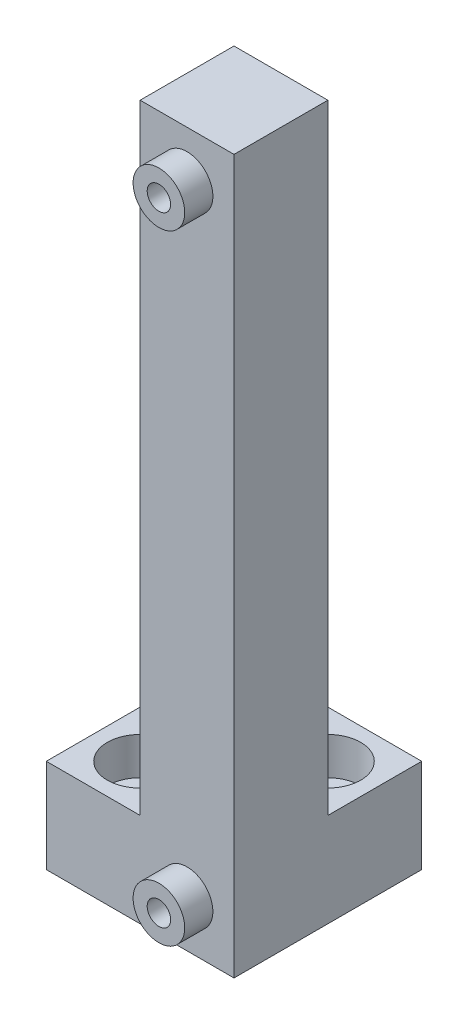
ISO-10303-21;
HEADER;
FILE_DESCRIPTION(('STEP AP214'),'2;1');
FILE_NAME('part.step','',(''),(''),'','','');
FILE_SCHEMA(('AUTOMOTIVE_DESIGN { 1 0 10303 214 1 1 1 1 }'));
ENDSEC;
DATA;
#1=APPLICATION_CONTEXT('core data for automotive mechanical design processes');
#2=APPLICATION_PROTOCOL_DEFINITION('international standard','automotive_design',2000,#1);
#3=PRODUCT_CONTEXT('',#1,'mechanical');
#4=PRODUCT('Part','Part','',(#3));
#5=PRODUCT_RELATED_PRODUCT_CATEGORY('part','',(#4));
#6=PRODUCT_DEFINITION_FORMATION('','',#4);
#7=PRODUCT_DEFINITION_CONTEXT('part definition',#1,'design');
#8=PRODUCT_DEFINITION('design','',#6,#7);
#9=PRODUCT_DEFINITION_SHAPE('','',#8);
#10=(LENGTH_UNIT() NAMED_UNIT(*) SI_UNIT(.MILLI.,.METRE.));
#11=(NAMED_UNIT(*) PLANE_ANGLE_UNIT() SI_UNIT($,.RADIAN.));
#12=(NAMED_UNIT(*) SI_UNIT($,.STERADIAN.) SOLID_ANGLE_UNIT());
#13=UNCERTAINTY_MEASURE_WITH_UNIT(LENGTH_MEASURE(1.E-05),#10,'distance_accuracy_value','');
#14=(GEOMETRIC_REPRESENTATION_CONTEXT(3) GLOBAL_UNCERTAINTY_ASSIGNED_CONTEXT((#13)) GLOBAL_UNIT_ASSIGNED_CONTEXT((#10,
#11,#12)) REPRESENTATION_CONTEXT('',''));
#15=CARTESIAN_POINT('',(0.,0.,0.));
#16=DIRECTION('',(0.,0.,1.));
#17=DIRECTION('',(1.,0.,0.));
#18=AXIS2_PLACEMENT_3D('',#15,#16,#17);
#19=CARTESIAN_POINT('',(-5.,-0.00100000000000447,-5.));
#20=DIRECTION('',(0.,1.,0.));
#21=DIRECTION('',(-1.,0.,0.));
#22=AXIS2_PLACEMENT_3D('',#19,#20,#21);
#23=CYLINDRICAL_SURFACE('',#22,1.75);
#24=CARTESIAN_POINT('',(-5.,0.,-5.));
#25=DIRECTION('',(0.,1.,0.));
#26=DIRECTION('',(0.,0.,1.));
#27=AXIS2_PLACEMENT_3D('',#24,#25,#26);
#28=CIRCLE('',#27,1.75);
#29=CARTESIAN_POINT('',(-5.,0.,-3.25));
#30=VERTEX_POINT('',#29);
#31=EDGE_CURVE('E138',#30,#30,#28,.F.);
#32=ORIENTED_EDGE('',*,*,#31,.T.);
#33=EDGE_LOOP('',(#32));
#34=FACE_BOUND('',#33,.T.);
#35=CARTESIAN_POINT('',(-5.,5.99999999999999,-5.));
#36=DIRECTION('',(0.,1.,0.));
#37=DIRECTION('',(-1.,0.,0.));
#38=AXIS2_PLACEMENT_3D('',#35,#36,#37);
#39=CIRCLE('',#38,1.75);
#40=CARTESIAN_POINT('',(-6.75,5.99999999999999,-5.));
#41=VERTEX_POINT('',#40);
#42=EDGE_CURVE('E38',#41,#41,#39,.F.);
#43=ORIENTED_EDGE('',*,*,#42,.F.);
#44=EDGE_LOOP('',(#43));
#45=FACE_BOUND('',#44,.T.);
#46=ADVANCED_FACE('F34',(#34,#45),#23,.F.);
#47=CARTESIAN_POINT('',(-15.,-0.001000000000001,5.));
#48=DIRECTION('',(0.,1.,0.));
#49=DIRECTION('',(-1.,0.,0.));
#50=AXIS2_PLACEMENT_3D('',#47,#48,#49);
#51=CYLINDRICAL_SURFACE('',#50,1.75);
#52=CARTESIAN_POINT('',(-15.,0.,5.));
#53=DIRECTION('',(0.,1.,0.));
#54=DIRECTION('',(0.,0.,1.));
#55=AXIS2_PLACEMENT_3D('',#52,#53,#54);
#56=CIRCLE('',#55,1.75);
#57=CARTESIAN_POINT('',(-15.,0.,6.75));
#58=VERTEX_POINT('',#57);
#59=EDGE_CURVE('E144',#58,#58,#56,.F.);
#60=ORIENTED_EDGE('',*,*,#59,.T.);
#61=EDGE_LOOP('',(#60));
#62=FACE_BOUND('',#61,.T.);
#63=CARTESIAN_POINT('',(-15.,6.,5.));
#64=DIRECTION('',(0.,1.,0.));
#65=DIRECTION('',(-1.,0.,0.));
#66=AXIS2_PLACEMENT_3D('',#63,#64,#65);
#67=CIRCLE('',#66,1.75);
#68=CARTESIAN_POINT('',(-16.75,6.,5.));
#69=VERTEX_POINT('',#68);
#70=EDGE_CURVE('E206',#69,#69,#67,.F.);
#71=ORIENTED_EDGE('',*,*,#70,.F.);
#72=EDGE_LOOP('',(#71));
#73=FACE_BOUND('',#72,.T.);
#74=ADVANCED_FACE('F247',(#62,#73),#51,.F.);
#75=CARTESIAN_POINT('',(0.,0.,0.));
#76=DIRECTION('',(0.,0.,-1.));
#77=DIRECTION('',(-1.,0.,0.));
#78=AXIS2_PLACEMENT_3D('',#75,#76,#77);
#79=PLANE('',#78);
#80=DIRECTION('',(1.,0.,0.));
#81=VECTOR('',#80,1.);
#82=CARTESIAN_POINT('',(0.,9.99999999999999,0.));
#83=LINE('',#82,#81);
#84=CARTESIAN_POINT('',(-10.,9.99999999999999,0.));
#85=VERTEX_POINT('',#84);
#86=CARTESIAN_POINT('',(0.,9.99999999999999,0.));
#87=VERTEX_POINT('',#86);
#88=EDGE_CURVE('E134',#85,#87,#83,.T.);
#89=ORIENTED_EDGE('',*,*,#88,.F.);
#90=DIRECTION('',(0.,-1.,0.));
#91=VECTOR('',#90,1.);
#92=CARTESIAN_POINT('',(-10.,9.99999999999999,0.));
#93=LINE('',#92,#91);
#94=CARTESIAN_POINT('',(-10.,76.,0.));
#95=VERTEX_POINT('',#94);
#96=EDGE_CURVE('E169',#95,#85,#93,.T.);
#97=ORIENTED_EDGE('',*,*,#96,.F.);
#98=DIRECTION('',(-1.,0.,0.));
#99=VECTOR('',#98,1.);
#100=CARTESIAN_POINT('',(-10.,76.,0.));
#101=LINE('',#100,#99);
#102=CARTESIAN_POINT('',(0.,76.,0.));
#103=VERTEX_POINT('',#102);
#104=EDGE_CURVE('E174',#103,#95,#101,.T.);
#105=ORIENTED_EDGE('',*,*,#104,.F.);
#106=DIRECTION('',(0.,1.,0.));
#107=VECTOR('',#106,1.);
#108=CARTESIAN_POINT('',(0.,76.,0.));
#109=LINE('',#108,#107);
#110=EDGE_CURVE('E59',#87,#103,#109,.T.);
#111=ORIENTED_EDGE('',*,*,#110,.F.);
#112=EDGE_LOOP('',(#89,#97,#105,#111));
#113=FACE_BOUND('',#112,.T.);
#114=ADVANCED_FACE('F252',(#113),#79,.T.);
#115=CARTESIAN_POINT('',(-10.,9.99999999999999,10.));
#116=DIRECTION('',(1.,0.,0.));
#117=DIRECTION('',(0.,1.,0.));
#118=AXIS2_PLACEMENT_3D('',#115,#116,#117);
#119=PLANE('',#118);
#120=ORIENTED_EDGE('',*,*,#96,.T.);
#121=DIRECTION('',(0.,0.,-1.));
#122=VECTOR('',#121,1.);
#123=CARTESIAN_POINT('',(-10.,9.99999999999999,10.));
#124=LINE('',#123,#122);
#125=CARTESIAN_POINT('',(-10.,9.99999999999999,10.));
#126=VERTEX_POINT('',#125);
#127=EDGE_CURVE('E202',#126,#85,#124,.T.);
#128=ORIENTED_EDGE('',*,*,#127,.F.);
#129=DIRECTION('',(0.,-1.,0.));
#130=VECTOR('',#129,1.);
#131=CARTESIAN_POINT('',(-10.,9.99999999999999,10.));
#132=LINE('',#131,#130);
#133=CARTESIAN_POINT('',(-10.,76.,10.));
#134=VERTEX_POINT('',#133);
#135=EDGE_CURVE('E170',#134,#126,#132,.T.);
#136=ORIENTED_EDGE('',*,*,#135,.F.);
#137=DIRECTION('',(0.,0.,-1.));
#138=VECTOR('',#137,1.);
#139=CARTESIAN_POINT('',(-10.,76.,10.));
#140=LINE('',#139,#138);
#141=EDGE_CURVE('E183',#134,#95,#140,.T.);
#142=ORIENTED_EDGE('',*,*,#141,.T.);
#143=EDGE_LOOP('',(#120,#128,#136,#142));
#144=FACE_BOUND('',#143,.T.);
#145=ADVANCED_FACE('F36',(#144),#119,.F.);
#146=CARTESIAN_POINT('',(-20.,10.,10.));
#147=DIRECTION('',(0.,-1.,0.));
#148=DIRECTION('',(1.,0.,0.));
#149=AXIS2_PLACEMENT_3D('',#146,#147,#148);
#150=PLANE('',#149);
#151=CARTESIAN_POINT('',(-15.,10.,5.));
#152=DIRECTION('',(0.,1.,0.));
#153=DIRECTION('',(-1.,0.,0.));
#154=AXIS2_PLACEMENT_3D('',#151,#152,#153);
#155=CIRCLE('',#154,3.5);
#156=CARTESIAN_POINT('',(-18.5,10.,5.));
#157=VERTEX_POINT('',#156);
#158=EDGE_CURVE('E213',#157,#157,#155,.T.);
#159=ORIENTED_EDGE('',*,*,#158,.F.);
#160=EDGE_LOOP('',(#159));
#161=FACE_BOUND('',#160,.T.);
#162=DIRECTION('',(-1.,0.,0.));
#163=VECTOR('',#162,1.);
#164=CARTESIAN_POINT('',(-20.,10.,0.));
#165=LINE('',#164,#163);
#166=CARTESIAN_POINT('',(-20.,10.,0.));
#167=VERTEX_POINT('',#166);
#168=EDGE_CURVE('E185',#85,#167,#165,.T.);
#169=ORIENTED_EDGE('',*,*,#168,.T.);
#170=DIRECTION('',(0.,0.,-1.));
#171=VECTOR('',#170,1.);
#172=CARTESIAN_POINT('',(-20.,10.,10.));
#173=LINE('',#172,#171);
#174=CARTESIAN_POINT('',(-20.,10.,10.));
#175=VERTEX_POINT('',#174);
#176=EDGE_CURVE('E199',#175,#167,#173,.T.);
#177=ORIENTED_EDGE('',*,*,#176,.F.);
#178=DIRECTION('',(-1.,0.,0.));
#179=VECTOR('',#178,1.);
#180=CARTESIAN_POINT('',(-20.,10.,10.));
#181=LINE('',#180,#179);
#182=EDGE_CURVE('E173',#126,#175,#181,.T.);
#183=ORIENTED_EDGE('',*,*,#182,.F.);
#184=ORIENTED_EDGE('',*,*,#127,.T.);
#185=EDGE_LOOP('',(#169,#177,#183,#184));
#186=FACE_BOUND('',#185,.T.);
#187=ADVANCED_FACE('F243',(#161,#186),#150,.F.);
#188=CARTESIAN_POINT('',(-20.,0.,10.));
#189=DIRECTION('',(1.,0.,0.));
#190=DIRECTION('',(0.,1.,0.));
#191=AXIS2_PLACEMENT_3D('',#188,#189,#190);
#192=PLANE('',#191);
#193=DIRECTION('',(0.,-1.,0.));
#194=VECTOR('',#193,1.);
#195=CARTESIAN_POINT('',(-20.,0.,0.));
#196=LINE('',#195,#194);
#197=CARTESIAN_POINT('',(-20.,0.,0.));
#198=VERTEX_POINT('',#197);
#199=EDGE_CURVE('E187',#167,#198,#196,.T.);
#200=ORIENTED_EDGE('',*,*,#199,.T.);
#201=DIRECTION('',(0.,0.,-1.));
#202=VECTOR('',#201,1.);
#203=CARTESIAN_POINT('',(-20.,0.,10.));
#204=LINE('',#203,#202);
#205=CARTESIAN_POINT('',(-20.,0.,10.));
#206=VERTEX_POINT('',#205);
#207=EDGE_CURVE('E118',#206,#198,#204,.T.);
#208=ORIENTED_EDGE('',*,*,#207,.F.);
#209=DIRECTION('',(0.,-1.,0.));
#210=VECTOR('',#209,1.);
#211=CARTESIAN_POINT('',(-20.,0.,10.));
#212=LINE('',#211,#210);
#213=EDGE_CURVE('E176',#175,#206,#212,.T.);
#214=ORIENTED_EDGE('',*,*,#213,.F.);
#215=ORIENTED_EDGE('',*,*,#176,.T.);
#216=EDGE_LOOP('',(#200,#208,#214,#215));
#217=FACE_BOUND('',#216,.T.);
#218=ADVANCED_FACE('F234',(#217),#192,.F.);
#219=CARTESIAN_POINT('',(0.,0.,10.));
#220=DIRECTION('',(0.,1.,0.));
#221=DIRECTION('',(0.,0.,1.));
#222=AXIS2_PLACEMENT_3D('',#219,#220,#221);
#223=PLANE('',#222);
#224=ORIENTED_EDGE('',*,*,#59,.F.);
#225=EDGE_LOOP('',(#224));
#226=FACE_BOUND('',#225,.T.);
#227=ORIENTED_EDGE('',*,*,#31,.F.);
#228=EDGE_LOOP('',(#227));
#229=FACE_BOUND('',#228,.T.);
#230=DIRECTION('',(1.,0.,0.));
#231=VECTOR('',#230,1.);
#232=CARTESIAN_POINT('',(0.,0.,0.));
#233=LINE('',#232,#231);
#234=CARTESIAN_POINT('',(-10.,0.,0.));
#235=VERTEX_POINT('',#234);
#236=EDGE_CURVE('E189',#198,#235,#233,.T.);
#237=ORIENTED_EDGE('',*,*,#236,.T.);
#238=DIRECTION('',(0.,0.,1.));
#239=VECTOR('',#238,1.);
#240=CARTESIAN_POINT('',(-10.,0.,-10.));
#241=LINE('',#240,#239);
#242=CARTESIAN_POINT('',(-10.,0.,-10.));
#243=VERTEX_POINT('',#242);
#244=EDGE_CURVE('E125',#243,#235,#241,.T.);
#245=ORIENTED_EDGE('',*,*,#244,.F.);
#246=DIRECTION('',(-1.,0.,0.));
#247=VECTOR('',#246,1.);
#248=CARTESIAN_POINT('',(0.,0.,-10.));
#249=LINE('',#248,#247);
#250=CARTESIAN_POINT('',(0.,0.,-10.));
#251=VERTEX_POINT('',#250);
#252=EDGE_CURVE('E122',#251,#243,#249,.T.);
#253=ORIENTED_EDGE('',*,*,#252,.F.);
#254=DIRECTION('',(0.,0.,-1.));
#255=VECTOR('',#254,1.);
#256=CARTESIAN_POINT('',(0.,0.,10.));
#257=LINE('',#256,#255);
#258=CARTESIAN_POINT('',(0.,0.,10.));
#259=VERTEX_POINT('',#258);
#260=EDGE_CURVE('E108',#259,#251,#257,.T.);
#261=ORIENTED_EDGE('',*,*,#260,.F.);
#262=DIRECTION('',(1.,0.,0.));
#263=VECTOR('',#262,1.);
#264=CARTESIAN_POINT('',(0.,0.,10.));
#265=LINE('',#264,#263);
#266=EDGE_CURVE('E178',#206,#259,#265,.T.);
#267=ORIENTED_EDGE('',*,*,#266,.F.);
#268=ORIENTED_EDGE('',*,*,#207,.T.);
#269=EDGE_LOOP('',(#237,#245,#253,#261,#267,#268));
#270=FACE_BOUND('',#269,.T.);
#271=ADVANCED_FACE('F123',(#226,#229,#270),#223,.F.);
#272=CARTESIAN_POINT('',(0.,76.,10.));
#273=DIRECTION('',(-1.,0.,0.));
#274=DIRECTION('',(0.,-1.,0.));
#275=AXIS2_PLACEMENT_3D('',#272,#273,#274);
#276=PLANE('',#275);
#277=ORIENTED_EDGE('',*,*,#260,.T.);
#278=DIRECTION('',(0.,-1.,0.));
#279=VECTOR('',#278,1.);
#280=CARTESIAN_POINT('',(0.,9.99999999999999,-10.));
#281=LINE('',#280,#279);
#282=CARTESIAN_POINT('',(0.,9.99999999999999,-10.));
#283=VERTEX_POINT('',#282);
#284=EDGE_CURVE('E113',#283,#251,#281,.T.);
#285=ORIENTED_EDGE('',*,*,#284,.F.);
#286=DIRECTION('',(0.,0.,1.));
#287=VECTOR('',#286,1.);
#288=CARTESIAN_POINT('',(0.,9.99999999999999,-10.));
#289=LINE('',#288,#287);
#290=EDGE_CURVE('E143',#283,#87,#289,.T.);
#291=ORIENTED_EDGE('',*,*,#290,.T.);
#292=ORIENTED_EDGE('',*,*,#110,.T.);
#293=DIRECTION('',(0.,0.,-1.));
#294=VECTOR('',#293,1.);
#295=CARTESIAN_POINT('',(0.,76.,10.));
#296=LINE('',#295,#294);
#297=CARTESIAN_POINT('',(0.,76.,10.));
#298=VERTEX_POINT('',#297);
#299=EDGE_CURVE('E119',#298,#103,#296,.T.);
#300=ORIENTED_EDGE('',*,*,#299,.F.);
#301=DIRECTION('',(0.,1.,0.));
#302=VECTOR('',#301,1.);
#303=CARTESIAN_POINT('',(0.,76.,10.));
#304=LINE('',#303,#302);
#305=EDGE_CURVE('E115',#259,#298,#304,.T.);
#306=ORIENTED_EDGE('',*,*,#305,.F.);
#307=EDGE_LOOP('',(#277,#285,#291,#292,#300,#306));
#308=FACE_BOUND('',#307,.T.);
#309=ADVANCED_FACE('F110',(#308),#276,.F.);
#310=CARTESIAN_POINT('',(-10.,76.,10.));
#311=DIRECTION('',(0.,-1.,0.));
#312=DIRECTION('',(0.,0.,-1.));
#313=AXIS2_PLACEMENT_3D('',#310,#311,#312);
#314=PLANE('',#313);
#315=ORIENTED_EDGE('',*,*,#104,.T.);
#316=ORIENTED_EDGE('',*,*,#141,.F.);
#317=DIRECTION('',(-1.,0.,0.));
#318=VECTOR('',#317,1.);
#319=CARTESIAN_POINT('',(-10.,76.,10.));
#320=LINE('',#319,#318);
#321=EDGE_CURVE('E181',#298,#134,#320,.T.);
#322=ORIENTED_EDGE('',*,*,#321,.F.);
#323=ORIENTED_EDGE('',*,*,#299,.T.);
#324=EDGE_LOOP('',(#315,#316,#322,#323));
#325=FACE_BOUND('',#324,.T.);
#326=ADVANCED_FACE('F241',(#325),#314,.F.);
#327=CARTESIAN_POINT('',(0.,0.,10.));
#328=DIRECTION('',(0.,0.,-1.));
#329=DIRECTION('',(-1.,0.,0.));
#330=AXIS2_PLACEMENT_3D('',#327,#328,#329);
#331=PLANE('',#330);
#332=CARTESIAN_POINT('',(-5.,5.,10.));
#333=DIRECTION('',(0.,0.,-1.));
#334=DIRECTION('',(-1.,0.,0.));
#335=AXIS2_PLACEMENT_3D('',#332,#333,#334);
#336=CIRCLE('',#335,2.75);
#337=CARTESIAN_POINT('',(-7.75,5.,10.));
#338=VERTEX_POINT('',#337);
#339=EDGE_CURVE('E11',#338,#338,#336,.F.);
#340=ORIENTED_EDGE('',*,*,#339,.F.);
#341=EDGE_LOOP('',(#340));
#342=FACE_BOUND('',#341,.T.);
#343=CARTESIAN_POINT('',(-5.,71.,10.));
#344=DIRECTION('',(0.,0.,-1.));
#345=DIRECTION('',(-1.,0.,0.));
#346=AXIS2_PLACEMENT_3D('',#343,#344,#345);
#347=CIRCLE('',#346,2.75);
#348=CARTESIAN_POINT('',(-7.75,71.,10.));
#349=VERTEX_POINT('',#348);
#350=EDGE_CURVE('E43',#349,#349,#347,.F.);
#351=ORIENTED_EDGE('',*,*,#350,.F.);
#352=EDGE_LOOP('',(#351));
#353=FACE_BOUND('',#352,.T.);
#354=ORIENTED_EDGE('',*,*,#135,.T.);
#355=ORIENTED_EDGE('',*,*,#182,.T.);
#356=ORIENTED_EDGE('',*,*,#213,.T.);
#357=ORIENTED_EDGE('',*,*,#266,.T.);
#358=ORIENTED_EDGE('',*,*,#305,.T.);
#359=ORIENTED_EDGE('',*,*,#321,.T.);
#360=EDGE_LOOP('',(#354,#355,#356,#357,#358,#359));
#361=FACE_BOUND('',#360,.T.);
#362=ADVANCED_FACE('F300',(#342,#353,#361),#331,.F.);
#363=DIRECTION('',(0.,1.,0.));
#364=VECTOR('',#363,1.);
#365=CARTESIAN_POINT('',(-10.,9.99999999999999,0.));
#366=LINE('',#365,#364);
#367=EDGE_CURVE('E51',#235,#85,#366,.T.);
#368=ORIENTED_EDGE('',*,*,#367,.F.);
#369=ORIENTED_EDGE('',*,*,#236,.F.);
#370=ORIENTED_EDGE('',*,*,#199,.F.);
#371=ORIENTED_EDGE('',*,*,#168,.F.);
#372=EDGE_LOOP('',(#368,#369,#370,#371));
#373=FACE_BOUND('',#372,.T.);
#374=ADVANCED_FACE('F298',(#373),#79,.T.);
#375=CARTESIAN_POINT('',(-5.,71.,13.));
#376=DIRECTION('',(0.,0.,-1.));
#377=DIRECTION('',(-1.,0.,0.));
#378=AXIS2_PLACEMENT_3D('',#375,#376,#377);
#379=CYLINDRICAL_SURFACE('',#378,2.75);
#380=CARTESIAN_POINT('',(-5.,71.,13.));
#381=DIRECTION('',(0.,0.,1.));
#382=DIRECTION('',(1.,0.,0.));
#383=AXIS2_PLACEMENT_3D('',#380,#381,#382);
#384=CIRCLE('',#383,2.75);
#385=CARTESIAN_POINT('',(-2.25,71.,13.));
#386=VERTEX_POINT('',#385);
#387=EDGE_CURVE('E166',#386,#386,#384,.T.);
#388=ORIENTED_EDGE('',*,*,#387,.F.);
#389=EDGE_LOOP('',(#388));
#390=FACE_BOUND('',#389,.T.);
#391=ORIENTED_EDGE('',*,*,#350,.T.);
#392=EDGE_LOOP('',(#391));
#393=FACE_BOUND('',#392,.T.);
#394=ADVANCED_FACE('F294',(#390,#393),#379,.T.);
#395=CARTESIAN_POINT('',(-5.,71.,13.));
#396=DIRECTION('',(0.,0.,1.));
#397=DIRECTION('',(1.,0.,0.));
#398=AXIS2_PLACEMENT_3D('',#395,#396,#397);
#399=PLANE('',#398);
#400=CARTESIAN_POINT('',(-5.,71.,13.));
#401=DIRECTION('',(0.,0.,1.));
#402=DIRECTION('',(1.,0.,0.));
#403=AXIS2_PLACEMENT_3D('',#400,#401,#402);
#404=CIRCLE('',#403,1.25);
#405=CARTESIAN_POINT('',(-3.75,71.,13.));
#406=VERTEX_POINT('',#405);
#407=EDGE_CURVE('E156',#406,#406,#404,.T.);
#408=ORIENTED_EDGE('',*,*,#407,.F.);
#409=EDGE_LOOP('',(#408));
#410=FACE_BOUND('',#409,.T.);
#411=ORIENTED_EDGE('',*,*,#387,.T.);
#412=EDGE_LOOP('',(#411));
#413=FACE_BOUND('',#412,.T.);
#414=ADVANCED_FACE('F290',(#410,#413),#399,.T.);
#415=CARTESIAN_POINT('',(-5.,5.,13.));
#416=DIRECTION('',(0.,0.,-1.));
#417=DIRECTION('',(-1.,0.,0.));
#418=AXIS2_PLACEMENT_3D('',#415,#416,#417);
#419=CYLINDRICAL_SURFACE('',#418,2.75);
#420=CARTESIAN_POINT('',(-5.,5.,13.));
#421=DIRECTION('',(0.,0.,1.));
#422=DIRECTION('',(1.,0.,0.));
#423=AXIS2_PLACEMENT_3D('',#420,#421,#422);
#424=CIRCLE('',#423,2.75);
#425=CARTESIAN_POINT('',(-2.25,5.,13.));
#426=VERTEX_POINT('',#425);
#427=EDGE_CURVE('E155',#426,#426,#424,.T.);
#428=ORIENTED_EDGE('',*,*,#427,.F.);
#429=EDGE_LOOP('',(#428));
#430=FACE_BOUND('',#429,.T.);
#431=ORIENTED_EDGE('',*,*,#339,.T.);
#432=EDGE_LOOP('',(#431));
#433=FACE_BOUND('',#432,.T.);
#434=ADVANCED_FACE('F286',(#430,#433),#419,.T.);
#435=CARTESIAN_POINT('',(-5.,5.,13.));
#436=DIRECTION('',(0.,0.,1.));
#437=DIRECTION('',(1.,0.,0.));
#438=AXIS2_PLACEMENT_3D('',#435,#436,#437);
#439=PLANE('',#438);
#440=CARTESIAN_POINT('',(-5.,5.,13.));
#441=DIRECTION('',(0.,0.,1.));
#442=DIRECTION('',(1.,0.,0.));
#443=AXIS2_PLACEMENT_3D('',#440,#441,#442);
#444=CIRCLE('',#443,1.25);
#445=CARTESIAN_POINT('',(-3.75,5.,13.));
#446=VERTEX_POINT('',#445);
#447=EDGE_CURVE('E151',#446,#446,#444,.T.);
#448=ORIENTED_EDGE('',*,*,#447,.F.);
#449=EDGE_LOOP('',(#448));
#450=FACE_BOUND('',#449,.T.);
#451=ORIENTED_EDGE('',*,*,#427,.T.);
#452=EDGE_LOOP('',(#451));
#453=FACE_BOUND('',#452,.T.);
#454=ADVANCED_FACE('F282',(#450,#453),#439,.T.);
#455=CARTESIAN_POINT('',(-5.,5.,5.));
#456=DIRECTION('',(0.,0.,1.));
#457=DIRECTION('',(1.,0.,0.));
#458=AXIS2_PLACEMENT_3D('',#455,#456,#457);
#459=CYLINDRICAL_SURFACE('',#458,1.25);
#460=CARTESIAN_POINT('',(-5.,5.,5.));
#461=DIRECTION('',(0.,0.,1.));
#462=DIRECTION('',(1.,0.,0.));
#463=AXIS2_PLACEMENT_3D('',#460,#461,#462);
#464=CIRCLE('',#463,1.25);
#465=CARTESIAN_POINT('',(-3.75,5.,5.));
#466=VERTEX_POINT('',#465);
#467=EDGE_CURVE('E159',#466,#466,#464,.T.);
#468=ORIENTED_EDGE('',*,*,#467,.F.);
#469=EDGE_LOOP('',(#468));
#470=FACE_BOUND('',#469,.T.);
#471=ORIENTED_EDGE('',*,*,#447,.T.);
#472=EDGE_LOOP('',(#471));
#473=FACE_BOUND('',#472,.T.);
#474=ADVANCED_FACE('F278',(#470,#473),#459,.F.);
#475=CARTESIAN_POINT('',(-5.,5.,5.));
#476=DIRECTION('',(0.,0.,1.));
#477=DIRECTION('',(1.,0.,0.));
#478=AXIS2_PLACEMENT_3D('',#475,#476,#477);
#479=PLANE('',#478);
#480=ORIENTED_EDGE('',*,*,#467,.T.);
#481=EDGE_LOOP('',(#480));
#482=FACE_BOUND('',#481,.T.);
#483=ADVANCED_FACE('F274',(#482),#479,.T.);
#484=CARTESIAN_POINT('',(-5.,71.,5.));
#485=DIRECTION('',(0.,0.,1.));
#486=DIRECTION('',(1.,0.,0.));
#487=AXIS2_PLACEMENT_3D('',#484,#485,#486);
#488=CYLINDRICAL_SURFACE('',#487,1.25);
#489=CARTESIAN_POINT('',(-5.,71.,5.));
#490=DIRECTION('',(0.,0.,1.));
#491=DIRECTION('',(1.,0.,0.));
#492=AXIS2_PLACEMENT_3D('',#489,#490,#491);
#493=CIRCLE('',#492,1.25);
#494=CARTESIAN_POINT('',(-3.75,71.,5.));
#495=VERTEX_POINT('',#494);
#496=EDGE_CURVE('E152',#495,#495,#493,.T.);
#497=ORIENTED_EDGE('',*,*,#496,.F.);
#498=EDGE_LOOP('',(#497));
#499=FACE_BOUND('',#498,.T.);
#500=ORIENTED_EDGE('',*,*,#407,.T.);
#501=EDGE_LOOP('',(#500));
#502=FACE_BOUND('',#501,.T.);
#503=ADVANCED_FACE('F270',(#499,#502),#488,.F.);
#504=CARTESIAN_POINT('',(-5.,71.,5.));
#505=DIRECTION('',(0.,0.,1.));
#506=DIRECTION('',(1.,0.,0.));
#507=AXIS2_PLACEMENT_3D('',#504,#505,#506);
#508=PLANE('',#507);
#509=ORIENTED_EDGE('',*,*,#496,.T.);
#510=EDGE_LOOP('',(#509));
#511=FACE_BOUND('',#510,.T.);
#512=ADVANCED_FACE('F266',(#511),#508,.T.);
#513=CARTESIAN_POINT('',(-10.,9.99999999999999,-10.));
#514=DIRECTION('',(1.,0.,0.));
#515=DIRECTION('',(0.,1.,0.));
#516=AXIS2_PLACEMENT_3D('',#513,#514,#515);
#517=PLANE('',#516);
#518=ORIENTED_EDGE('',*,*,#367,.T.);
#519=DIRECTION('',(0.,0.,1.));
#520=VECTOR('',#519,1.);
#521=CARTESIAN_POINT('',(-10.,9.99999999999999,-10.));
#522=LINE('',#521,#520);
#523=CARTESIAN_POINT('',(-10.,9.99999999999999,-10.));
#524=VERTEX_POINT('',#523);
#525=EDGE_CURVE('E147',#524,#85,#522,.T.);
#526=ORIENTED_EDGE('',*,*,#525,.F.);
#527=DIRECTION('',(0.,1.,0.));
#528=VECTOR('',#527,1.);
#529=CARTESIAN_POINT('',(-10.,9.99999999999999,-10.));
#530=LINE('',#529,#528);
#531=EDGE_CURVE('E128',#243,#524,#530,.T.);
#532=ORIENTED_EDGE('',*,*,#531,.F.);
#533=ORIENTED_EDGE('',*,*,#244,.T.);
#534=EDGE_LOOP('',(#518,#526,#532,#533));
#535=FACE_BOUND('',#534,.T.);
#536=ADVANCED_FACE('F262',(#535),#517,.F.);
#537=CARTESIAN_POINT('',(0.,9.99999999999999,-10.));
#538=DIRECTION('',(0.,-1.,0.));
#539=DIRECTION('',(0.,0.,-1.));
#540=AXIS2_PLACEMENT_3D('',#537,#538,#539);
#541=PLANE('',#540);
#542=CARTESIAN_POINT('',(-5.,9.99999999999999,-5.));
#543=DIRECTION('',(0.,1.,0.));
#544=DIRECTION('',(-1.,0.,0.));
#545=AXIS2_PLACEMENT_3D('',#542,#543,#544);
#546=CIRCLE('',#545,3.5);
#547=CARTESIAN_POINT('',(-8.5,9.99999999999999,-5.));
#548=VERTEX_POINT('',#547);
#549=EDGE_CURVE('E223',#548,#548,#546,.T.);
#550=ORIENTED_EDGE('',*,*,#549,.F.);
#551=EDGE_LOOP('',(#550));
#552=FACE_BOUND('',#551,.T.);
#553=ORIENTED_EDGE('',*,*,#88,.T.);
#554=ORIENTED_EDGE('',*,*,#290,.F.);
#555=DIRECTION('',(1.,0.,0.));
#556=VECTOR('',#555,1.);
#557=CARTESIAN_POINT('',(0.,9.99999999999999,-10.));
#558=LINE('',#557,#556);
#559=EDGE_CURVE('E132',#524,#283,#558,.T.);
#560=ORIENTED_EDGE('',*,*,#559,.F.);
#561=ORIENTED_EDGE('',*,*,#525,.T.);
#562=EDGE_LOOP('',(#553,#554,#560,#561));
#563=FACE_BOUND('',#562,.T.);
#564=ADVANCED_FACE('F259',(#552,#563),#541,.F.);
#565=CARTESIAN_POINT('',(0.,0.,-10.));
#566=DIRECTION('',(0.,0.,-1.));
#567=DIRECTION('',(-1.,0.,0.));
#568=AXIS2_PLACEMENT_3D('',#565,#566,#567);
#569=PLANE('',#568);
#570=ORIENTED_EDGE('',*,*,#284,.T.);
#571=ORIENTED_EDGE('',*,*,#252,.T.);
#572=ORIENTED_EDGE('',*,*,#531,.T.);
#573=ORIENTED_EDGE('',*,*,#559,.T.);
#574=EDGE_LOOP('',(#570,#571,#572,#573));
#575=FACE_BOUND('',#574,.T.);
#576=ADVANCED_FACE('F130',(#575),#569,.T.);
#577=CARTESIAN_POINT('',(-15.,6.,5.));
#578=DIRECTION('',(0.,1.,0.));
#579=DIRECTION('',(-1.,0.,0.));
#580=AXIS2_PLACEMENT_3D('',#577,#578,#579);
#581=PLANE('',#580);
#582=CARTESIAN_POINT('',(-15.,6.,5.));
#583=DIRECTION('',(0.,1.,0.));
#584=DIRECTION('',(-1.,0.,0.));
#585=AXIS2_PLACEMENT_3D('',#582,#583,#584);
#586=CIRCLE('',#585,3.5);
#587=CARTESIAN_POINT('',(-18.5,6.,5.));
#588=VERTEX_POINT('',#587);
#589=EDGE_CURVE('E208',#588,#588,#586,.T.);
#590=ORIENTED_EDGE('',*,*,#589,.T.);
#591=EDGE_LOOP('',(#590));
#592=FACE_BOUND('',#591,.T.);
#593=ORIENTED_EDGE('',*,*,#70,.T.);
#594=EDGE_LOOP('',(#593));
#595=FACE_BOUND('',#594,.T.);
#596=ADVANCED_FACE('F258',(#592,#595),#581,.T.);
#597=CARTESIAN_POINT('',(-15.,6.,5.));
#598=DIRECTION('',(0.,1.,0.));
#599=DIRECTION('',(-1.,0.,0.));
#600=AXIS2_PLACEMENT_3D('',#597,#598,#599);
#601=CYLINDRICAL_SURFACE('',#600,3.5);
#602=ORIENTED_EDGE('',*,*,#589,.F.);
#603=EDGE_LOOP('',(#602));
#604=FACE_BOUND('',#603,.T.);
#605=ORIENTED_EDGE('',*,*,#158,.T.);
#606=EDGE_LOOP('',(#605));
#607=FACE_BOUND('',#606,.T.);
#608=ADVANCED_FACE('F331',(#604,#607),#601,.F.);
#609=CARTESIAN_POINT('',(-5.,5.99999999999999,-5.));
#610=DIRECTION('',(0.,1.,0.));
#611=DIRECTION('',(-1.,0.,0.));
#612=AXIS2_PLACEMENT_3D('',#609,#610,#611);
#613=PLANE('',#612);
#614=CARTESIAN_POINT('',(-5.,5.99999999999999,-5.));
#615=DIRECTION('',(0.,1.,0.));
#616=DIRECTION('',(-1.,0.,0.));
#617=AXIS2_PLACEMENT_3D('',#614,#615,#616);
#618=CIRCLE('',#617,3.5);
#619=CARTESIAN_POINT('',(-8.5,5.99999999999999,-5.));
#620=VERTEX_POINT('',#619);
#621=EDGE_CURVE('E218',#620,#620,#618,.T.);
#622=ORIENTED_EDGE('',*,*,#621,.T.);
#623=EDGE_LOOP('',(#622));
#624=FACE_BOUND('',#623,.T.);
#625=ORIENTED_EDGE('',*,*,#42,.T.);
#626=EDGE_LOOP('',(#625));
#627=FACE_BOUND('',#626,.T.);
#628=ADVANCED_FACE('F333',(#624,#627),#613,.T.);
#629=CARTESIAN_POINT('',(-5.,5.99999999999999,-5.));
#630=DIRECTION('',(0.,1.,0.));
#631=DIRECTION('',(-1.,0.,0.));
#632=AXIS2_PLACEMENT_3D('',#629,#630,#631);
#633=CYLINDRICAL_SURFACE('',#632,3.5);
#634=ORIENTED_EDGE('',*,*,#621,.F.);
#635=EDGE_LOOP('',(#634));
#636=FACE_BOUND('',#635,.T.);
#637=ORIENTED_EDGE('',*,*,#549,.T.);
#638=EDGE_LOOP('',(#637));
#639=FACE_BOUND('',#638,.T.);
#640=ADVANCED_FACE('F340',(#636,#639),#633,.F.);
#641=CLOSED_SHELL('',(#46,#74,#114,#145,#187,#218,#271,#309,#326,#362,#374,#394,#414,#434,#454,
#474,#483,#503,#512,#536,#564,#576,#596,#608,#628,#640));
#642=MANIFOLD_SOLID_BREP('B2',#641);
#643=ADVANCED_BREP_SHAPE_REPRESENTATION('',(#18,#642),#14);
#644=SHAPE_DEFINITION_REPRESENTATION(#9,#643);
ENDSEC;
END-ISO-10303-21;
